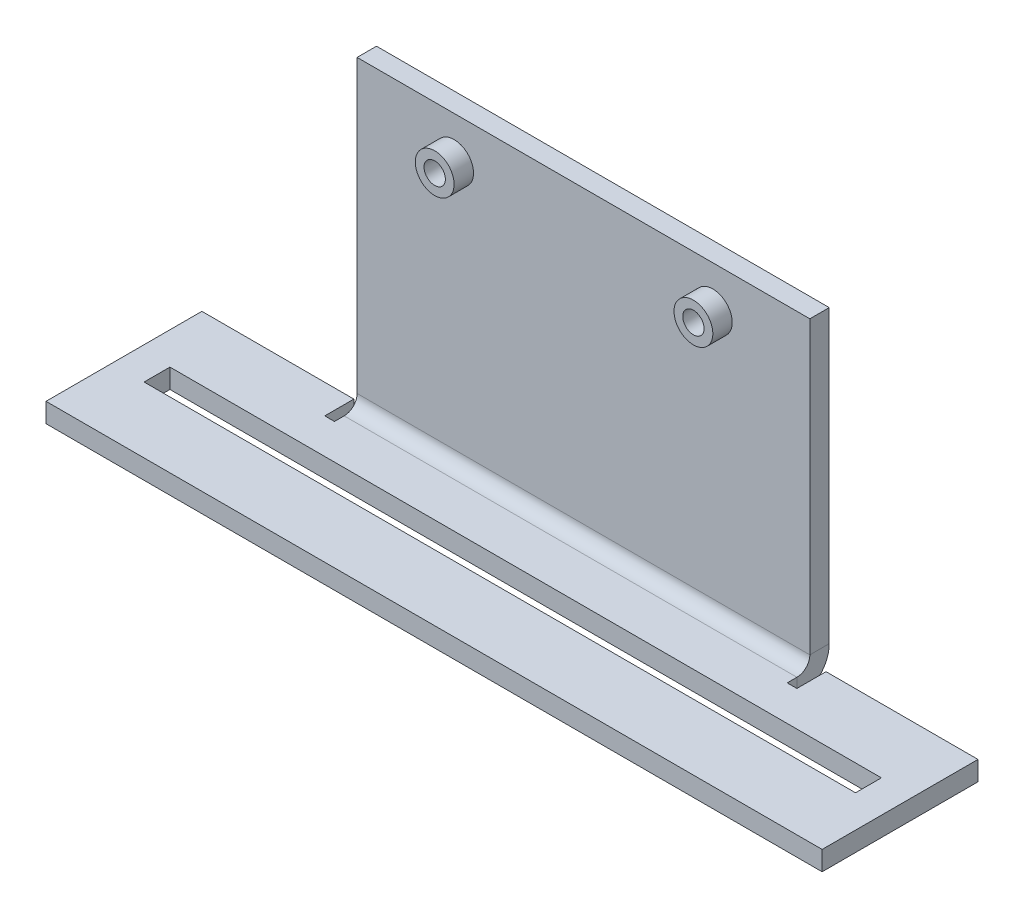
ISO-10303-21;
HEADER;
FILE_DESCRIPTION(('STEP AP214'),'2;1');
FILE_NAME('part.step','',(''),(''),'','','');
FILE_SCHEMA(('AUTOMOTIVE_DESIGN { 1 0 10303 214 1 1 1 1 }'));
ENDSEC;
DATA;
#1=APPLICATION_CONTEXT('core data for automotive mechanical design processes');
#2=APPLICATION_PROTOCOL_DEFINITION('international standard','automotive_design',2000,#1);
#3=PRODUCT_CONTEXT('',#1,'mechanical');
#4=PRODUCT('Part','Part','',(#3));
#5=PRODUCT_RELATED_PRODUCT_CATEGORY('part','',(#4));
#6=PRODUCT_DEFINITION_FORMATION('','',#4);
#7=PRODUCT_DEFINITION_CONTEXT('part definition',#1,'design');
#8=PRODUCT_DEFINITION('design','',#6,#7);
#9=PRODUCT_DEFINITION_SHAPE('','',#8);
#10=(LENGTH_UNIT() NAMED_UNIT(*) SI_UNIT(.MILLI.,.METRE.));
#11=(NAMED_UNIT(*) PLANE_ANGLE_UNIT() SI_UNIT($,.RADIAN.));
#12=(NAMED_UNIT(*) SI_UNIT($,.STERADIAN.) SOLID_ANGLE_UNIT());
#13=UNCERTAINTY_MEASURE_WITH_UNIT(LENGTH_MEASURE(1.E-05),#10,'distance_accuracy_value','');
#14=(GEOMETRIC_REPRESENTATION_CONTEXT(3) GLOBAL_UNCERTAINTY_ASSIGNED_CONTEXT((#13)) GLOBAL_UNIT_ASSIGNED_CONTEXT((#10,
#11,#12)) REPRESENTATION_CONTEXT('',''));
#15=CARTESIAN_POINT('',(0.,0.,0.));
#16=DIRECTION('',(0.,0.,1.));
#17=DIRECTION('',(1.,0.,0.));
#18=AXIS2_PLACEMENT_3D('',#15,#16,#17);
#19=CARTESIAN_POINT('',(25.,-3.,17.652065));
#20=DIRECTION('',(0.,0.,-1.));
#21=DIRECTION('',(-1.,0.,0.));
#22=AXIS2_PLACEMENT_3D('',#19,#20,#21);
#23=PLANE('',#22);
#24=DIRECTION('',(-1.,0.,0.));
#25=VECTOR('',#24,1.);
#26=CARTESIAN_POINT('',(25.,0.,17.652065));
#27=LINE('',#26,#25);
#28=CARTESIAN_POINT('',(23.5,0.,17.652065));
#29=VERTEX_POINT('',#28);
#30=CARTESIAN_POINT('',(0.,0.,17.652065));
#31=VERTEX_POINT('',#30);
#32=EDGE_CURVE('E392',#29,#31,#27,.T.);
#33=ORIENTED_EDGE('',*,*,#32,.F.);
#34=DIRECTION('',(0.,-1.,0.));
#35=VECTOR('',#34,1.);
#36=CARTESIAN_POINT('',(23.5,-3.,17.652065));
#37=LINE('',#36,#35);
#38=CARTESIAN_POINT('',(23.5,-3.,17.652065));
#39=VERTEX_POINT('',#38);
#40=EDGE_CURVE('E382',#29,#39,#37,.T.);
#41=ORIENTED_EDGE('',*,*,#40,.T.);
#42=DIRECTION('',(-1.,0.,0.));
#43=VECTOR('',#42,1.);
#44=CARTESIAN_POINT('',(25.,-3.,17.652065));
#45=LINE('',#44,#43);
#46=CARTESIAN_POINT('',(0.,-3.,17.652065));
#47=VERTEX_POINT('',#46);
#48=EDGE_CURVE('E404',#39,#47,#45,.T.);
#49=ORIENTED_EDGE('',*,*,#48,.T.);
#50=DIRECTION('',(0.,1.,0.));
#51=VECTOR('',#50,1.);
#52=CARTESIAN_POINT('',(0.,-3.,17.652065));
#53=LINE('',#52,#51);
#54=EDGE_CURVE('E76',#47,#31,#53,.T.);
#55=ORIENTED_EDGE('',*,*,#54,.T.);
#56=EDGE_LOOP('',(#33,#41,#49,#55));
#57=FACE_BOUND('',#56,.T.);
#58=ADVANCED_FACE('F67',(#57),#23,.T.);
#59=CARTESIAN_POINT('',(120.,-3.,17.652065));
#60=DIRECTION('',(0.,0.,-1.));
#61=DIRECTION('',(-1.,0.,0.));
#62=AXIS2_PLACEMENT_3D('',#59,#60,#61);
#63=PLANE('',#62);
#64=DIRECTION('',(-1.,0.,0.));
#65=VECTOR('',#64,1.);
#66=CARTESIAN_POINT('',(120.,-3.,17.652065));
#67=LINE('',#66,#65);
#68=CARTESIAN_POINT('',(120.,-3.,17.652065));
#69=VERTEX_POINT('',#68);
#70=CARTESIAN_POINT('',(96.5,-3.,17.652065));
#71=VERTEX_POINT('',#70);
#72=EDGE_CURVE('E400',#69,#71,#67,.T.);
#73=ORIENTED_EDGE('',*,*,#72,.T.);
#74=DIRECTION('',(0.,1.,0.));
#75=VECTOR('',#74,1.);
#76=CARTESIAN_POINT('',(96.5,-3.,17.652065));
#77=LINE('',#76,#75);
#78=CARTESIAN_POINT('',(96.5,0.,17.652065));
#79=VERTEX_POINT('',#78);
#80=EDGE_CURVE('E363',#71,#79,#77,.T.);
#81=ORIENTED_EDGE('',*,*,#80,.T.);
#82=DIRECTION('',(-1.,0.,0.));
#83=VECTOR('',#82,1.);
#84=CARTESIAN_POINT('',(120.,0.,17.652065));
#85=LINE('',#84,#83);
#86=CARTESIAN_POINT('',(120.,0.,17.652065));
#87=VERTEX_POINT('',#86);
#88=EDGE_CURVE('E419',#87,#79,#85,.T.);
#89=ORIENTED_EDGE('',*,*,#88,.F.);
#90=DIRECTION('',(0.,1.,0.));
#91=VECTOR('',#90,1.);
#92=CARTESIAN_POINT('',(120.,-3.,17.652065));
#93=LINE('',#92,#91);
#94=EDGE_CURVE('E428',#69,#87,#93,.T.);
#95=ORIENTED_EDGE('',*,*,#94,.F.);
#96=EDGE_LOOP('',(#73,#81,#89,#95));
#97=FACE_BOUND('',#96,.T.);
#98=ADVANCED_FACE('F459',(#97),#63,.T.);
#99=CARTESIAN_POINT('',(0.,-3.,0.));
#100=DIRECTION('',(0.,1.,0.));
#101=DIRECTION('',(0.,0.,1.));
#102=AXIS2_PLACEMENT_3D('',#99,#100,#101);
#103=PLANE('',#102);
#104=DIRECTION('',(-1.,0.,0.));
#105=VECTOR('',#104,1.);
#106=CARTESIAN_POINT('',(0.,-3.,27.5882648403536));
#107=LINE('',#106,#105);
#108=CARTESIAN_POINT('',(115.,-3.,27.5882648403536));
#109=VERTEX_POINT('',#108);
#110=CARTESIAN_POINT('',(5.,-3.,27.5882648403536));
#111=VERTEX_POINT('',#110);
#112=EDGE_CURVE('E245',#109,#111,#107,.T.);
#113=ORIENTED_EDGE('',*,*,#112,.T.);
#114=DIRECTION('',(0.,0.,1.));
#115=VECTOR('',#114,1.);
#116=CARTESIAN_POINT('',(4.99999999999999,-3.,0.));
#117=LINE('',#116,#115);
#118=CARTESIAN_POINT('',(5.,-3.,31.5882648403536));
#119=VERTEX_POINT('',#118);
#120=EDGE_CURVE('E249',#111,#119,#117,.T.);
#121=ORIENTED_EDGE('',*,*,#120,.T.);
#122=DIRECTION('',(1.,0.,0.));
#123=VECTOR('',#122,1.);
#124=CARTESIAN_POINT('',(0.,-3.,31.5882648403536));
#125=LINE('',#124,#123);
#126=CARTESIAN_POINT('',(115.,-3.,31.5882648403536));
#127=VERTEX_POINT('',#126);
#128=EDGE_CURVE('E236',#119,#127,#125,.T.);
#129=ORIENTED_EDGE('',*,*,#128,.T.);
#130=DIRECTION('',(0.,0.,-1.));
#131=VECTOR('',#130,1.);
#132=CARTESIAN_POINT('',(115.,-3.,0.));
#133=LINE('',#132,#131);
#134=EDGE_CURVE('E211',#127,#109,#133,.T.);
#135=ORIENTED_EDGE('',*,*,#134,.T.);
#136=EDGE_LOOP('',(#113,#121,#129,#135));
#137=FACE_BOUND('',#136,.T.);
#138=DIRECTION('',(0.,0.,-1.));
#139=VECTOR('',#138,1.);
#140=CARTESIAN_POINT('',(23.5,-3.,0.));
#141=LINE('',#140,#139);
#142=CARTESIAN_POINT('',(23.5,-3.,22.152065));
#143=VERTEX_POINT('',#142);
#144=EDGE_CURVE('E379',#143,#39,#141,.T.);
#145=ORIENTED_EDGE('',*,*,#144,.F.);
#146=DIRECTION('',(-1.,0.,0.));
#147=VECTOR('',#146,1.);
#148=CARTESIAN_POINT('',(0.,-3.,22.152065));
#149=LINE('',#148,#147);
#150=CARTESIAN_POINT('',(25.,-3.,22.152065));
#151=VERTEX_POINT('',#150);
#152=EDGE_CURVE('E376',#151,#143,#149,.T.);
#153=ORIENTED_EDGE('',*,*,#152,.F.);
#154=DIRECTION('',(0.,0.,1.));
#155=VECTOR('',#154,1.);
#156=CARTESIAN_POINT('',(25.,-3.,0.));
#157=LINE('',#156,#155);
#158=CARTESIAN_POINT('',(25.,-3.00000000000003,20.652065));
#159=VERTEX_POINT('',#158);
#160=EDGE_CURVE('E373',#159,#151,#157,.T.);
#161=ORIENTED_EDGE('',*,*,#160,.F.);
#162=DIRECTION('',(-1.,0.,0.));
#163=VECTOR('',#162,1.);
#164=CARTESIAN_POINT('',(25.,-3.00000000000003,20.652065));
#165=LINE('',#164,#163);
#166=CARTESIAN_POINT('',(95.,-3.,20.652065));
#167=VERTEX_POINT('',#166);
#168=EDGE_CURVE('E296',#159,#167,#165,.F.);
#169=ORIENTED_EDGE('',*,*,#168,.T.);
#170=DIRECTION('',(0.,0.,-1.));
#171=VECTOR('',#170,1.);
#172=CARTESIAN_POINT('',(95.,-3.,0.));
#173=LINE('',#172,#171);
#174=CARTESIAN_POINT('',(95.,-3.,22.152065));
#175=VERTEX_POINT('',#174);
#176=EDGE_CURVE('E370',#175,#167,#173,.T.);
#177=ORIENTED_EDGE('',*,*,#176,.F.);
#178=DIRECTION('',(-1.,0.,0.));
#179=VECTOR('',#178,1.);
#180=CARTESIAN_POINT('',(0.,-3.,22.152065));
#181=LINE('',#180,#179);
#182=CARTESIAN_POINT('',(96.5,-3.,22.152065));
#183=VERTEX_POINT('',#182);
#184=EDGE_CURVE('E367',#183,#175,#181,.T.);
#185=ORIENTED_EDGE('',*,*,#184,.F.);
#186=DIRECTION('',(0.,0.,1.));
#187=VECTOR('',#186,1.);
#188=CARTESIAN_POINT('',(96.5,-3.,0.));
#189=LINE('',#188,#187);
#190=EDGE_CURVE('E332',#71,#183,#189,.T.);
#191=ORIENTED_EDGE('',*,*,#190,.F.);
#192=ORIENTED_EDGE('',*,*,#72,.F.);
#193=DIRECTION('',(0.,0.,-1.));
#194=VECTOR('',#193,1.);
#195=CARTESIAN_POINT('',(120.,-3.,41.752065));
#196=LINE('',#195,#194);
#197=CARTESIAN_POINT('',(120.,-3.,41.752065));
#198=VERTEX_POINT('',#197);
#199=EDGE_CURVE('E396',#198,#69,#196,.T.);
#200=ORIENTED_EDGE('',*,*,#199,.F.);
#201=DIRECTION('',(1.,0.,0.));
#202=VECTOR('',#201,1.);
#203=CARTESIAN_POINT('',(0.,-3.,41.752065));
#204=LINE('',#203,#202);
#205=CARTESIAN_POINT('',(0.,-3.,41.752065));
#206=VERTEX_POINT('',#205);
#207=EDGE_CURVE('E391',#206,#198,#204,.T.);
#208=ORIENTED_EDGE('',*,*,#207,.F.);
#209=DIRECTION('',(0.,0.,1.));
#210=VECTOR('',#209,1.);
#211=CARTESIAN_POINT('',(0.,-3.,17.652065));
#212=LINE('',#211,#210);
#213=EDGE_CURVE('E387',#47,#206,#212,.T.);
#214=ORIENTED_EDGE('',*,*,#213,.F.);
#215=ORIENTED_EDGE('',*,*,#48,.F.);
#216=EDGE_LOOP('',(#145,#153,#161,#169,#177,#185,#191,#192,#200,#208,#214,#215));
#217=FACE_BOUND('',#216,.T.);
#218=ADVANCED_FACE('F449',(#137,#217),#103,.F.);
#219=CARTESIAN_POINT('',(0.,0.,0.));
#220=DIRECTION('',(0.,1.,0.));
#221=DIRECTION('',(0.,0.,1.));
#222=AXIS2_PLACEMENT_3D('',#219,#220,#221);
#223=PLANE('',#222);
#224=DIRECTION('',(0.,0.,1.));
#225=VECTOR('',#224,1.);
#226=CARTESIAN_POINT('',(5.,0.,27.5882648403536));
#227=LINE('',#226,#225);
#228=CARTESIAN_POINT('',(5.,0.,27.5882648403536));
#229=VERTEX_POINT('',#228);
#230=CARTESIAN_POINT('',(5.,0.,31.5882648403536));
#231=VERTEX_POINT('',#230);
#232=EDGE_CURVE('E91',#229,#231,#227,.T.);
#233=ORIENTED_EDGE('',*,*,#232,.F.);
#234=DIRECTION('',(-1.,0.,0.));
#235=VECTOR('',#234,1.);
#236=CARTESIAN_POINT('',(5.,0.,27.5882648403536));
#237=LINE('',#236,#235);
#238=CARTESIAN_POINT('',(115.,0.,27.5882648403536));
#239=VERTEX_POINT('',#238);
#240=EDGE_CURVE('E226',#239,#229,#237,.T.);
#241=ORIENTED_EDGE('',*,*,#240,.F.);
#242=DIRECTION('',(0.,0.,-1.));
#243=VECTOR('',#242,1.);
#244=CARTESIAN_POINT('',(115.,0.,27.5882648403536));
#245=LINE('',#244,#243);
#246=CARTESIAN_POINT('',(115.,0.,31.5882648403536));
#247=VERTEX_POINT('',#246);
#248=EDGE_CURVE('E208',#247,#239,#245,.T.);
#249=ORIENTED_EDGE('',*,*,#248,.F.);
#250=DIRECTION('',(1.,0.,0.));
#251=VECTOR('',#250,1.);
#252=CARTESIAN_POINT('',(5.,0.,31.5882648403536));
#253=LINE('',#252,#251);
#254=EDGE_CURVE('E218',#231,#247,#253,.T.);
#255=ORIENTED_EDGE('',*,*,#254,.F.);
#256=EDGE_LOOP('',(#233,#241,#249,#255));
#257=FACE_BOUND('',#256,.T.);
#258=DIRECTION('',(1.,0.,0.));
#259=VECTOR('',#258,1.);
#260=CARTESIAN_POINT('',(23.5,0.,22.152065));
#261=LINE('',#260,#259);
#262=CARTESIAN_POINT('',(23.5,0.,22.152065));
#263=VERTEX_POINT('',#262);
#264=CARTESIAN_POINT('',(25.,0.,22.152065));
#265=VERTEX_POINT('',#264);
#266=EDGE_CURVE('E328',#263,#265,#261,.T.);
#267=ORIENTED_EDGE('',*,*,#266,.F.);
#268=DIRECTION('',(0.,0.,-1.));
#269=VECTOR('',#268,1.);
#270=CARTESIAN_POINT('',(23.5,0.,0.));
#271=LINE('',#270,#269);
#272=EDGE_CURVE('E13',#263,#29,#271,.T.);
#273=ORIENTED_EDGE('',*,*,#272,.T.);
#274=ORIENTED_EDGE('',*,*,#32,.T.);
#275=DIRECTION('',(0.,0.,1.));
#276=VECTOR('',#275,1.);
#277=CARTESIAN_POINT('',(0.,0.,17.652065));
#278=LINE('',#277,#276);
#279=CARTESIAN_POINT('',(0.,0.,41.752065));
#280=VERTEX_POINT('',#279);
#281=EDGE_CURVE('E386',#31,#280,#278,.T.);
#282=ORIENTED_EDGE('',*,*,#281,.T.);
#283=DIRECTION('',(1.,0.,0.));
#284=VECTOR('',#283,1.);
#285=CARTESIAN_POINT('',(0.,0.,41.752065));
#286=LINE('',#285,#284);
#287=CARTESIAN_POINT('',(120.,0.,41.752065));
#288=VERTEX_POINT('',#287);
#289=EDGE_CURVE('E411',#280,#288,#286,.T.);
#290=ORIENTED_EDGE('',*,*,#289,.T.);
#291=DIRECTION('',(0.,0.,-1.));
#292=VECTOR('',#291,1.);
#293=CARTESIAN_POINT('',(120.,0.,41.752065));
#294=LINE('',#293,#292);
#295=EDGE_CURVE('E415',#288,#87,#294,.T.);
#296=ORIENTED_EDGE('',*,*,#295,.T.);
#297=ORIENTED_EDGE('',*,*,#88,.T.);
#298=DIRECTION('',(0.,0.,-1.));
#299=VECTOR('',#298,1.);
#300=CARTESIAN_POINT('',(96.5,0.,22.152065));
#301=LINE('',#300,#299);
#302=CARTESIAN_POINT('',(96.5,0.,22.152065));
#303=VERTEX_POINT('',#302);
#304=EDGE_CURVE('E346',#303,#79,#301,.T.);
#305=ORIENTED_EDGE('',*,*,#304,.F.);
#306=DIRECTION('',(1.,0.,0.));
#307=VECTOR('',#306,1.);
#308=CARTESIAN_POINT('',(95.,0.,22.152065));
#309=LINE('',#308,#307);
#310=CARTESIAN_POINT('',(95.,0.,22.152065));
#311=VERTEX_POINT('',#310);
#312=EDGE_CURVE('E342',#311,#303,#309,.T.);
#313=ORIENTED_EDGE('',*,*,#312,.F.);
#314=DIRECTION('',(0.,0.,1.));
#315=VECTOR('',#314,1.);
#316=CARTESIAN_POINT('',(95.,0.,20.652065));
#317=LINE('',#316,#315);
#318=CARTESIAN_POINT('',(95.,0.,20.652065));
#319=VERTEX_POINT('',#318);
#320=EDGE_CURVE('E338',#319,#311,#317,.T.);
#321=ORIENTED_EDGE('',*,*,#320,.F.);
#322=DIRECTION('',(-1.,0.,0.));
#323=VECTOR('',#322,1.);
#324=CARTESIAN_POINT('',(25.,0.,20.652065));
#325=LINE('',#324,#323);
#326=CARTESIAN_POINT('',(25.,0.,20.652065));
#327=VERTEX_POINT('',#326);
#328=EDGE_CURVE('E313',#327,#319,#325,.F.);
#329=ORIENTED_EDGE('',*,*,#328,.F.);
#330=DIRECTION('',(0.,0.,-1.));
#331=VECTOR('',#330,1.);
#332=CARTESIAN_POINT('',(25.,0.,22.152065));
#333=LINE('',#332,#331);
#334=EDGE_CURVE('E334',#265,#327,#333,.T.);
#335=ORIENTED_EDGE('',*,*,#334,.F.);
#336=EDGE_LOOP('',(#267,#273,#274,#282,#290,#296,#297,#305,#313,#321,#329,#335));
#337=FACE_BOUND('',#336,.T.);
#338=ADVANCED_FACE('F223',(#257,#337),#223,.T.);
#339=CARTESIAN_POINT('',(0.,-3.,17.652065));
#340=DIRECTION('',(-1.,0.,0.));
#341=DIRECTION('',(0.,0.,1.));
#342=AXIS2_PLACEMENT_3D('',#339,#340,#341);
#343=PLANE('',#342);
#344=ORIENTED_EDGE('',*,*,#281,.F.);
#345=ORIENTED_EDGE('',*,*,#54,.F.);
#346=ORIENTED_EDGE('',*,*,#213,.T.);
#347=DIRECTION('',(0.,1.,0.));
#348=VECTOR('',#347,1.);
#349=CARTESIAN_POINT('',(0.,-3.,41.752065));
#350=LINE('',#349,#348);
#351=EDGE_CURVE('E407',#206,#280,#350,.T.);
#352=ORIENTED_EDGE('',*,*,#351,.T.);
#353=EDGE_LOOP('',(#344,#345,#346,#352));
#354=FACE_BOUND('',#353,.T.);
#355=ADVANCED_FACE('F69',(#354),#343,.T.);
#356=CARTESIAN_POINT('',(120.,-3.,41.752065));
#357=DIRECTION('',(1.,0.,0.));
#358=DIRECTION('',(0.,0.,-1.));
#359=AXIS2_PLACEMENT_3D('',#356,#357,#358);
#360=PLANE('',#359);
#361=ORIENTED_EDGE('',*,*,#295,.F.);
#362=DIRECTION('',(0.,1.,0.));
#363=VECTOR('',#362,1.);
#364=CARTESIAN_POINT('',(120.,-3.,41.752065));
#365=LINE('',#364,#363);
#366=EDGE_CURVE('E431',#198,#288,#365,.T.);
#367=ORIENTED_EDGE('',*,*,#366,.F.);
#368=ORIENTED_EDGE('',*,*,#199,.T.);
#369=ORIENTED_EDGE('',*,*,#94,.T.);
#370=EDGE_LOOP('',(#361,#367,#368,#369));
#371=FACE_BOUND('',#370,.T.);
#372=ADVANCED_FACE('F454',(#371),#360,.T.);
#373=CARTESIAN_POINT('',(0.,-3.,41.752065));
#374=DIRECTION('',(0.,0.,1.));
#375=DIRECTION('',(1.,0.,0.));
#376=AXIS2_PLACEMENT_3D('',#373,#374,#375);
#377=PLANE('',#376);
#378=ORIENTED_EDGE('',*,*,#289,.F.);
#379=ORIENTED_EDGE('',*,*,#351,.F.);
#380=ORIENTED_EDGE('',*,*,#207,.T.);
#381=ORIENTED_EDGE('',*,*,#366,.T.);
#382=EDGE_LOOP('',(#378,#379,#380,#381));
#383=FACE_BOUND('',#382,.T.);
#384=ADVANCED_FACE('F441',(#383),#377,.T.);
#385=CARTESIAN_POINT('',(23.5,0.,22.152065));
#386=DIRECTION('',(0.,0.,-1.));
#387=DIRECTION('',(0.,1.,0.));
#388=AXIS2_PLACEMENT_3D('',#385,#386,#387);
#389=PLANE('',#388);
#390=DIRECTION('',(0.,-1.,0.));
#391=VECTOR('',#390,1.);
#392=CARTESIAN_POINT('',(25.,0.,22.152065));
#393=LINE('',#392,#391);
#394=EDGE_CURVE('E337',#265,#151,#393,.T.);
#395=ORIENTED_EDGE('',*,*,#394,.T.);
#396=ORIENTED_EDGE('',*,*,#152,.T.);
#397=DIRECTION('',(0.,-1.,0.));
#398=VECTOR('',#397,1.);
#399=CARTESIAN_POINT('',(23.5,0.,22.152065));
#400=LINE('',#399,#398);
#401=EDGE_CURVE('E333',#263,#143,#400,.T.);
#402=ORIENTED_EDGE('',*,*,#401,.F.);
#403=ORIENTED_EDGE('',*,*,#266,.T.);
#404=EDGE_LOOP('',(#395,#396,#402,#403));
#405=FACE_BOUND('',#404,.T.);
#406=ADVANCED_FACE('F525',(#405),#389,.T.);
#407=CARTESIAN_POINT('',(25.,0.,22.152065));
#408=DIRECTION('',(-1.,0.,0.));
#409=DIRECTION('',(0.,0.,1.));
#410=AXIS2_PLACEMENT_3D('',#407,#408,#409);
#411=PLANE('',#410);
#412=DIRECTION('',(0.,-1.,0.));
#413=VECTOR('',#412,1.);
#414=CARTESIAN_POINT('',(25.,0.,20.652065));
#415=LINE('',#414,#413);
#416=EDGE_CURVE('E305',#327,#159,#415,.T.);
#417=ORIENTED_EDGE('',*,*,#416,.T.);
#418=ORIENTED_EDGE('',*,*,#160,.T.);
#419=ORIENTED_EDGE('',*,*,#394,.F.);
#420=ORIENTED_EDGE('',*,*,#334,.T.);
#421=EDGE_LOOP('',(#417,#418,#419,#420));
#422=FACE_BOUND('',#421,.T.);
#423=ADVANCED_FACE('F529',(#422),#411,.T.);
#424=CARTESIAN_POINT('',(95.,0.,20.652065));
#425=DIRECTION('',(1.,0.,0.));
#426=DIRECTION('',(0.,0.,-1.));
#427=AXIS2_PLACEMENT_3D('',#424,#425,#426);
#428=PLANE('',#427);
#429=DIRECTION('',(0.,-1.,0.));
#430=VECTOR('',#429,1.);
#431=CARTESIAN_POINT('',(95.,0.,22.152065));
#432=LINE('',#431,#430);
#433=EDGE_CURVE('E345',#311,#175,#432,.T.);
#434=ORIENTED_EDGE('',*,*,#433,.T.);
#435=ORIENTED_EDGE('',*,*,#176,.T.);
#436=DIRECTION('',(0.,-1.,0.));
#437=VECTOR('',#436,1.);
#438=CARTESIAN_POINT('',(95.,0.,20.652065));
#439=LINE('',#438,#437);
#440=EDGE_CURVE('E320',#319,#167,#439,.T.);
#441=ORIENTED_EDGE('',*,*,#440,.F.);
#442=ORIENTED_EDGE('',*,*,#320,.T.);
#443=EDGE_LOOP('',(#434,#435,#441,#442));
#444=FACE_BOUND('',#443,.T.);
#445=ADVANCED_FACE('F468',(#444),#428,.T.);
#446=CARTESIAN_POINT('',(95.,0.,22.152065));
#447=DIRECTION('',(0.,0.,-1.));
#448=DIRECTION('',(0.,1.,0.));
#449=AXIS2_PLACEMENT_3D('',#446,#447,#448);
#450=PLANE('',#449);
#451=DIRECTION('',(0.,-1.,0.));
#452=VECTOR('',#451,1.);
#453=CARTESIAN_POINT('',(96.5,0.,22.152065));
#454=LINE('',#453,#452);
#455=EDGE_CURVE('E324',#303,#183,#454,.T.);
#456=ORIENTED_EDGE('',*,*,#455,.T.);
#457=ORIENTED_EDGE('',*,*,#184,.T.);
#458=ORIENTED_EDGE('',*,*,#433,.F.);
#459=ORIENTED_EDGE('',*,*,#312,.T.);
#460=EDGE_LOOP('',(#456,#457,#458,#459));
#461=FACE_BOUND('',#460,.T.);
#462=ADVANCED_FACE('F466',(#461),#450,.T.);
#463=CARTESIAN_POINT('',(23.5,0.,15.652065));
#464=DIRECTION('',(1.,0.,0.));
#465=DIRECTION('',(0.,0.,-1.));
#466=AXIS2_PLACEMENT_3D('',#463,#464,#465);
#467=PLANE('',#466);
#468=ORIENTED_EDGE('',*,*,#40,.F.);
#469=ORIENTED_EDGE('',*,*,#272,.F.);
#470=ORIENTED_EDGE('',*,*,#401,.T.);
#471=ORIENTED_EDGE('',*,*,#144,.T.);
#472=EDGE_LOOP('',(#468,#469,#470,#471));
#473=FACE_BOUND('',#472,.T.);
#474=ADVANCED_FACE('F539',(#473),#467,.T.);
#475=CARTESIAN_POINT('',(96.5,0.,22.152065));
#476=DIRECTION('',(-1.,0.,0.));
#477=DIRECTION('',(0.,0.,1.));
#478=AXIS2_PLACEMENT_3D('',#475,#476,#477);
#479=PLANE('',#478);
#480=ORIENTED_EDGE('',*,*,#80,.F.);
#481=ORIENTED_EDGE('',*,*,#190,.T.);
#482=ORIENTED_EDGE('',*,*,#455,.F.);
#483=ORIENTED_EDGE('',*,*,#304,.T.);
#484=EDGE_LOOP('',(#480,#481,#482,#483));
#485=FACE_BOUND('',#484,.T.);
#486=ADVANCED_FACE('F461',(#485),#479,.T.);
#487=CARTESIAN_POINT('',(95.,1.99999999999998,20.652065));
#488=DIRECTION('',(1.,0.,0.));
#489=DIRECTION('',(0.,0.,-1.));
#490=AXIS2_PLACEMENT_3D('',#487,#488,#489);
#491=PLANE('',#490);
#492=DIRECTION('',(0.,0.,1.));
#493=VECTOR('',#492,1.);
#494=CARTESIAN_POINT('',(95.,2.00000000000001,15.652065));
#495=LINE('',#494,#493);
#496=CARTESIAN_POINT('',(95.,1.99999999999997,18.652065));
#497=VERTEX_POINT('',#496);
#498=CARTESIAN_POINT('',(95.,1.99999999999996,15.652065));
#499=VERTEX_POINT('',#498);
#500=EDGE_CURVE('E253',#497,#499,#495,.F.);
#501=ORIENTED_EDGE('',*,*,#500,.F.);
#502=CARTESIAN_POINT('',(95.,1.99999999999998,20.652065));
#503=DIRECTION('',(-1.,0.,0.));
#504=DIRECTION('',(0.,0.,1.));
#505=AXIS2_PLACEMENT_3D('',#502,#503,#504);
#506=CIRCLE('',#505,2.00000000000001);
#507=EDGE_CURVE('E309',#319,#497,#506,.F.);
#508=ORIENTED_EDGE('',*,*,#507,.F.);
#509=ORIENTED_EDGE('',*,*,#440,.T.);
#510=CARTESIAN_POINT('',(95.,1.99999999999998,20.652065));
#511=DIRECTION('',(-1.,0.,0.));
#512=DIRECTION('',(0.,0.,1.));
#513=AXIS2_PLACEMENT_3D('',#510,#511,#512);
#514=CIRCLE('',#513,5.00000000000001);
#515=EDGE_CURVE('E300',#167,#499,#514,.F.);
#516=ORIENTED_EDGE('',*,*,#515,.T.);
#517=EDGE_LOOP('',(#501,#508,#509,#516));
#518=FACE_BOUND('',#517,.T.);
#519=ADVANCED_FACE('F479',(#518),#491,.T.);
#520=CARTESIAN_POINT('',(25.,1.99999999999998,20.652065));
#521=DIRECTION('',(1.,0.,0.));
#522=DIRECTION('',(0.,0.,-1.));
#523=AXIS2_PLACEMENT_3D('',#520,#521,#522);
#524=PLANE('',#523);
#525=CARTESIAN_POINT('',(25.,1.99999999999998,20.652065));
#526=DIRECTION('',(-1.,0.,0.));
#527=DIRECTION('',(0.,0.,1.));
#528=AXIS2_PLACEMENT_3D('',#525,#526,#527);
#529=CIRCLE('',#528,2.00000000000001);
#530=CARTESIAN_POINT('',(25.,1.99999999999997,18.652065));
#531=VERTEX_POINT('',#530);
#532=EDGE_CURVE('E258',#531,#327,#529,.T.);
#533=ORIENTED_EDGE('',*,*,#532,.F.);
#534=DIRECTION('',(0.,0.,1.));
#535=VECTOR('',#534,1.);
#536=CARTESIAN_POINT('',(25.,1.99999999999999,18.652065));
#537=LINE('',#536,#535);
#538=CARTESIAN_POINT('',(25.,2.00000000000001,15.652065));
#539=VERTEX_POINT('',#538);
#540=EDGE_CURVE('E286',#531,#539,#537,.F.);
#541=ORIENTED_EDGE('',*,*,#540,.T.);
#542=CARTESIAN_POINT('',(25.,1.99999999999998,20.652065));
#543=DIRECTION('',(-1.,0.,0.));
#544=DIRECTION('',(0.,0.,1.));
#545=AXIS2_PLACEMENT_3D('',#542,#543,#544);
#546=CIRCLE('',#545,5.00000000000001);
#547=EDGE_CURVE('E301',#539,#159,#546,.T.);
#548=ORIENTED_EDGE('',*,*,#547,.T.);
#549=ORIENTED_EDGE('',*,*,#416,.F.);
#550=EDGE_LOOP('',(#533,#541,#548,#549));
#551=FACE_BOUND('',#550,.T.);
#552=ADVANCED_FACE('F500',(#551),#524,.F.);
#553=CARTESIAN_POINT('',(25.,1.99999999999998,20.652065));
#554=DIRECTION('',(-1.,0.,0.));
#555=DIRECTION('',(0.,0.,-1.));
#556=AXIS2_PLACEMENT_3D('',#553,#554,#555);
#557=CYLINDRICAL_SURFACE('',#556,5.00000000000001);
#558=ORIENTED_EDGE('',*,*,#168,.F.);
#559=ORIENTED_EDGE('',*,*,#547,.F.);
#560=DIRECTION('',(-1.,0.,0.));
#561=VECTOR('',#560,1.);
#562=CARTESIAN_POINT('',(95.,2.00000000000001,15.652065));
#563=LINE('',#562,#561);
#564=EDGE_CURVE('E283',#539,#499,#563,.F.);
#565=ORIENTED_EDGE('',*,*,#564,.T.);
#566=ORIENTED_EDGE('',*,*,#515,.F.);
#567=EDGE_LOOP('',(#558,#559,#565,#566));
#568=FACE_BOUND('',#567,.T.);
#569=ADVANCED_FACE('F726',(#568),#557,.T.);
#570=CARTESIAN_POINT('',(25.,1.99999999999998,20.652065));
#571=DIRECTION('',(-1.,0.,0.));
#572=DIRECTION('',(0.,0.,-1.));
#573=AXIS2_PLACEMENT_3D('',#570,#571,#572);
#574=CYLINDRICAL_SURFACE('',#573,2.00000000000001);
#575=ORIENTED_EDGE('',*,*,#328,.T.);
#576=ORIENTED_EDGE('',*,*,#507,.T.);
#577=DIRECTION('',(-1.,0.,0.));
#578=VECTOR('',#577,1.);
#579=CARTESIAN_POINT('',(95.,1.99999999999999,18.652065));
#580=LINE('',#579,#578);
#581=EDGE_CURVE('E290',#497,#531,#580,.T.);
#582=ORIENTED_EDGE('',*,*,#581,.T.);
#583=ORIENTED_EDGE('',*,*,#532,.T.);
#584=EDGE_LOOP('',(#575,#576,#582,#583));
#585=FACE_BOUND('',#584,.T.);
#586=ADVANCED_FACE('F475',(#585),#574,.F.);
#587=CARTESIAN_POINT('',(95.,0.,15.652065));
#588=DIRECTION('',(-1.,0.,0.));
#589=DIRECTION('',(0.,0.,1.));
#590=AXIS2_PLACEMENT_3D('',#587,#588,#589);
#591=PLANE('',#590);
#592=ORIENTED_EDGE('',*,*,#500,.T.);
#593=DIRECTION('',(0.,-1.,0.));
#594=VECTOR('',#593,1.);
#595=CARTESIAN_POINT('',(95.,0.,15.652065));
#596=LINE('',#595,#594);
#597=CARTESIAN_POINT('',(95.,47.,15.6520649999998));
#598=VERTEX_POINT('',#597);
#599=EDGE_CURVE('E269',#598,#499,#596,.T.);
#600=ORIENTED_EDGE('',*,*,#599,.F.);
#601=DIRECTION('',(0.,0.,1.));
#602=VECTOR('',#601,1.);
#603=CARTESIAN_POINT('',(95.,47.,15.6520649999998));
#604=LINE('',#603,#602);
#605=CARTESIAN_POINT('',(95.,47.,18.6520649999998));
#606=VERTEX_POINT('',#605);
#607=EDGE_CURVE('E259',#598,#606,#604,.T.);
#608=ORIENTED_EDGE('',*,*,#607,.T.);
#609=DIRECTION('',(0.,1.,0.));
#610=VECTOR('',#609,1.);
#611=CARTESIAN_POINT('',(95.,0.,18.652065));
#612=LINE('',#611,#610);
#613=EDGE_CURVE('E279',#606,#497,#612,.F.);
#614=ORIENTED_EDGE('',*,*,#613,.T.);
#615=EDGE_LOOP('',(#592,#600,#608,#614));
#616=FACE_BOUND('',#615,.T.);
#617=ADVANCED_FACE('F483',(#616),#591,.F.);
#618=CARTESIAN_POINT('',(25.,47.,15.6520649999998));
#619=DIRECTION('',(1.,0.,0.));
#620=DIRECTION('',(0.,0.,-1.));
#621=AXIS2_PLACEMENT_3D('',#618,#619,#620);
#622=PLANE('',#621);
#623=ORIENTED_EDGE('',*,*,#540,.F.);
#624=DIRECTION('',(0.,-1.,0.));
#625=VECTOR('',#624,1.);
#626=CARTESIAN_POINT('',(25.,47.,18.6520649999998));
#627=LINE('',#626,#625);
#628=CARTESIAN_POINT('',(25.,47.,18.6520649999998));
#629=VERTEX_POINT('',#628);
#630=EDGE_CURVE('E276',#531,#629,#627,.F.);
#631=ORIENTED_EDGE('',*,*,#630,.T.);
#632=DIRECTION('',(0.,0.,1.));
#633=VECTOR('',#632,1.);
#634=CARTESIAN_POINT('',(25.,47.,15.6520649999998));
#635=LINE('',#634,#633);
#636=CARTESIAN_POINT('',(25.,47.,15.6520649999998));
#637=VERTEX_POINT('',#636);
#638=EDGE_CURVE('E254',#637,#629,#635,.T.);
#639=ORIENTED_EDGE('',*,*,#638,.F.);
#640=DIRECTION('',(0.,1.,0.));
#641=VECTOR('',#640,1.);
#642=CARTESIAN_POINT('',(25.,0.,15.652065));
#643=LINE('',#642,#641);
#644=EDGE_CURVE('E266',#539,#637,#643,.T.);
#645=ORIENTED_EDGE('',*,*,#644,.F.);
#646=EDGE_LOOP('',(#623,#631,#639,#645));
#647=FACE_BOUND('',#646,.T.);
#648=ADVANCED_FACE('F502',(#647),#622,.F.);
#649=CARTESIAN_POINT('',(0.,0.,15.652065));
#650=DIRECTION('',(0.,0.,1.));
#651=DIRECTION('',(0.,-1.,0.));
#652=AXIS2_PLACEMENT_3D('',#649,#650,#651);
#653=PLANE('',#652);
#654=CARTESIAN_POINT('',(40.,40.5,15.652065));
#655=DIRECTION('',(0.,0.,1.));
#656=DIRECTION('',(1.,0.,0.));
#657=AXIS2_PLACEMENT_3D('',#654,#655,#656);
#658=CIRCLE('',#657,1.65);
#659=CARTESIAN_POINT('',(41.65,40.5,15.652065));
#660=VERTEX_POINT('',#659);
#661=EDGE_CURVE('E582',#660,#660,#658,.T.);
#662=ORIENTED_EDGE('',*,*,#661,.T.);
#663=EDGE_LOOP('',(#662));
#664=FACE_BOUND('',#663,.T.);
#665=CARTESIAN_POINT('',(80.,40.5,15.652065));
#666=DIRECTION('',(0.,0.,1.));
#667=DIRECTION('',(1.,0.,0.));
#668=AXIS2_PLACEMENT_3D('',#665,#666,#667);
#669=CIRCLE('',#668,1.65000000000002);
#670=CARTESIAN_POINT('',(81.65,40.5,15.652065));
#671=VERTEX_POINT('',#670);
#672=EDGE_CURVE('E591',#671,#671,#669,.T.);
#673=ORIENTED_EDGE('',*,*,#672,.T.);
#674=EDGE_LOOP('',(#673));
#675=FACE_BOUND('',#674,.T.);
#676=ORIENTED_EDGE('',*,*,#564,.F.);
#677=ORIENTED_EDGE('',*,*,#644,.T.);
#678=DIRECTION('',(1.,0.,0.));
#679=VECTOR('',#678,1.);
#680=CARTESIAN_POINT('',(0.,47.,15.6520649999998));
#681=LINE('',#680,#679);
#682=EDGE_CURVE('E263',#637,#598,#681,.T.);
#683=ORIENTED_EDGE('',*,*,#682,.T.);
#684=ORIENTED_EDGE('',*,*,#599,.T.);
#685=EDGE_LOOP('',(#676,#677,#683,#684));
#686=FACE_BOUND('',#685,.T.);
#687=ADVANCED_FACE('F487',(#664,#675,#686),#653,.F.);
#688=CARTESIAN_POINT('',(0.,0.,18.652065));
#689=DIRECTION('',(0.,0.,1.));
#690=DIRECTION('',(0.,-1.,0.));
#691=AXIS2_PLACEMENT_3D('',#688,#689,#690);
#692=PLANE('',#691);
#693=CARTESIAN_POINT('',(40.,40.5,18.652065));
#694=DIRECTION('',(0.,0.,1.));
#695=DIRECTION('',(1.,0.,0.));
#696=AXIS2_PLACEMENT_3D('',#693,#694,#695);
#697=CIRCLE('',#696,3.);
#698=CARTESIAN_POINT('',(43.,40.5,18.652065));
#699=VERTEX_POINT('',#698);
#700=EDGE_CURVE('E569',#699,#699,#697,.T.);
#701=ORIENTED_EDGE('',*,*,#700,.F.);
#702=EDGE_LOOP('',(#701));
#703=FACE_BOUND('',#702,.T.);
#704=CARTESIAN_POINT('',(80.,40.5,18.652065));
#705=DIRECTION('',(0.,0.,1.));
#706=DIRECTION('',(-1.,0.,0.));
#707=AXIS2_PLACEMENT_3D('',#704,#705,#706);
#708=CIRCLE('',#707,3.00000000000001);
#709=CARTESIAN_POINT('',(77.,40.5,18.652065));
#710=VERTEX_POINT('',#709);
#711=EDGE_CURVE('E572',#710,#710,#708,.T.);
#712=ORIENTED_EDGE('',*,*,#711,.F.);
#713=EDGE_LOOP('',(#712));
#714=FACE_BOUND('',#713,.T.);
#715=ORIENTED_EDGE('',*,*,#630,.F.);
#716=ORIENTED_EDGE('',*,*,#581,.F.);
#717=ORIENTED_EDGE('',*,*,#613,.F.);
#718=DIRECTION('',(-1.,0.,0.));
#719=VECTOR('',#718,1.);
#720=CARTESIAN_POINT('',(95.,47.,18.6520649999998));
#721=LINE('',#720,#719);
#722=EDGE_CURVE('E273',#629,#606,#721,.F.);
#723=ORIENTED_EDGE('',*,*,#722,.F.);
#724=EDGE_LOOP('',(#715,#716,#717,#723));
#725=FACE_BOUND('',#724,.T.);
#726=ADVANCED_FACE('F497',(#703,#714,#725),#692,.T.);
#727=CARTESIAN_POINT('',(95.,47.,15.6520649999998));
#728=DIRECTION('',(0.,-1.,0.));
#729=DIRECTION('',(0.,0.,-1.));
#730=AXIS2_PLACEMENT_3D('',#727,#728,#729);
#731=PLANE('',#730);
#732=ORIENTED_EDGE('',*,*,#722,.T.);
#733=ORIENTED_EDGE('',*,*,#607,.F.);
#734=ORIENTED_EDGE('',*,*,#682,.F.);
#735=ORIENTED_EDGE('',*,*,#638,.T.);
#736=EDGE_LOOP('',(#732,#733,#734,#735));
#737=FACE_BOUND('',#736,.T.);
#738=ADVANCED_FACE('F493',(#737),#731,.F.);
#739=CARTESIAN_POINT('',(5.,-30.,27.5882648403536));
#740=DIRECTION('',(-1.,0.,0.));
#741=DIRECTION('',(0.,0.,1.));
#742=AXIS2_PLACEMENT_3D('',#739,#740,#741);
#743=PLANE('',#742);
#744=DIRECTION('',(0.,1.,0.));
#745=VECTOR('',#744,1.);
#746=CARTESIAN_POINT('',(5.,-30.,27.5882648403536));
#747=LINE('',#746,#745);
#748=EDGE_CURVE('E233',#111,#229,#747,.T.);
#749=ORIENTED_EDGE('',*,*,#748,.T.);
#750=ORIENTED_EDGE('',*,*,#232,.T.);
#751=DIRECTION('',(0.,1.,0.));
#752=VECTOR('',#751,1.);
#753=CARTESIAN_POINT('',(5.,-30.,31.5882648403536));
#754=LINE('',#753,#752);
#755=EDGE_CURVE('E215',#119,#231,#754,.T.);
#756=ORIENTED_EDGE('',*,*,#755,.F.);
#757=ORIENTED_EDGE('',*,*,#120,.F.);
#758=EDGE_LOOP('',(#749,#750,#756,#757));
#759=FACE_BOUND('',#758,.T.);
#760=ADVANCED_FACE('F550',(#759),#743,.F.);
#761=CARTESIAN_POINT('',(5.,-30.,27.5882648403536));
#762=DIRECTION('',(0.,0.,-1.));
#763=DIRECTION('',(-1.,0.,0.));
#764=AXIS2_PLACEMENT_3D('',#761,#762,#763);
#765=PLANE('',#764);
#766=DIRECTION('',(0.,1.,0.));
#767=VECTOR('',#766,1.);
#768=CARTESIAN_POINT('',(115.,-30.,27.5882648403536));
#769=LINE('',#768,#767);
#770=EDGE_CURVE('E214',#109,#239,#769,.T.);
#771=ORIENTED_EDGE('',*,*,#770,.T.);
#772=ORIENTED_EDGE('',*,*,#240,.T.);
#773=ORIENTED_EDGE('',*,*,#748,.F.);
#774=ORIENTED_EDGE('',*,*,#112,.F.);
#775=EDGE_LOOP('',(#771,#772,#773,#774));
#776=FACE_BOUND('',#775,.T.);
#777=ADVANCED_FACE('F549',(#776),#765,.F.);
#778=CARTESIAN_POINT('',(115.,-30.,27.5882648403536));
#779=DIRECTION('',(1.,0.,0.));
#780=DIRECTION('',(0.,0.,-1.));
#781=AXIS2_PLACEMENT_3D('',#778,#779,#780);
#782=PLANE('',#781);
#783=DIRECTION('',(0.,1.,0.));
#784=VECTOR('',#783,1.);
#785=CARTESIAN_POINT('',(115.,-30.,31.5882648403536));
#786=LINE('',#785,#784);
#787=EDGE_CURVE('E83',#127,#247,#786,.T.);
#788=ORIENTED_EDGE('',*,*,#787,.T.);
#789=ORIENTED_EDGE('',*,*,#248,.T.);
#790=ORIENTED_EDGE('',*,*,#770,.F.);
#791=ORIENTED_EDGE('',*,*,#134,.F.);
#792=EDGE_LOOP('',(#788,#789,#790,#791));
#793=FACE_BOUND('',#792,.T.);
#794=ADVANCED_FACE('F205',(#793),#782,.F.);
#795=CARTESIAN_POINT('',(5.,-30.,31.5882648403536));
#796=DIRECTION('',(0.,0.,1.));
#797=DIRECTION('',(1.,0.,0.));
#798=AXIS2_PLACEMENT_3D('',#795,#796,#797);
#799=PLANE('',#798);
#800=ORIENTED_EDGE('',*,*,#755,.T.);
#801=ORIENTED_EDGE('',*,*,#254,.T.);
#802=ORIENTED_EDGE('',*,*,#787,.F.);
#803=ORIENTED_EDGE('',*,*,#128,.F.);
#804=EDGE_LOOP('',(#800,#801,#802,#803));
#805=FACE_BOUND('',#804,.T.);
#806=ADVANCED_FACE('F219',(#805),#799,.F.);
#807=CARTESIAN_POINT('',(80.,40.5,21.652065));
#808=DIRECTION('',(0.,0.,-1.));
#809=DIRECTION('',(-1.,0.,0.));
#810=AXIS2_PLACEMENT_3D('',#807,#808,#809);
#811=CYLINDRICAL_SURFACE('',#810,3.00000000000001);
#812=CARTESIAN_POINT('',(80.,40.5,21.652065));
#813=DIRECTION('',(0.,0.,1.));
#814=DIRECTION('',(-1.,0.,0.));
#815=AXIS2_PLACEMENT_3D('',#812,#813,#814);
#816=CIRCLE('',#815,3.00000000000001);
#817=CARTESIAN_POINT('',(77.,40.5,21.652065));
#818=VERTEX_POINT('',#817);
#819=EDGE_CURVE('E575',#818,#818,#816,.T.);
#820=ORIENTED_EDGE('',*,*,#819,.F.);
#821=EDGE_LOOP('',(#820));
#822=FACE_BOUND('',#821,.T.);
#823=ORIENTED_EDGE('',*,*,#711,.T.);
#824=EDGE_LOOP('',(#823));
#825=FACE_BOUND('',#824,.T.);
#826=ADVANCED_FACE('F628',(#822,#825),#811,.T.);
#827=CARTESIAN_POINT('',(80.,40.5,21.652065));
#828=DIRECTION('',(0.,0.,-1.));
#829=DIRECTION('',(-1.,0.,0.));
#830=AXIS2_PLACEMENT_3D('',#827,#828,#829);
#831=PLANE('',#830);
#832=CARTESIAN_POINT('',(80.,40.5,21.652065));
#833=DIRECTION('',(0.,0.,1.));
#834=DIRECTION('',(1.,0.,0.));
#835=AXIS2_PLACEMENT_3D('',#832,#833,#834);
#836=CIRCLE('',#835,1.65000000000002);
#837=CARTESIAN_POINT('',(81.65,40.5,21.652065));
#838=VERTEX_POINT('',#837);
#839=EDGE_CURVE('E595',#838,#838,#836,.T.);
#840=ORIENTED_EDGE('',*,*,#839,.F.);
#841=EDGE_LOOP('',(#840));
#842=FACE_BOUND('',#841,.T.);
#843=ORIENTED_EDGE('',*,*,#819,.T.);
#844=EDGE_LOOP('',(#843));
#845=FACE_BOUND('',#844,.T.);
#846=ADVANCED_FACE('F623',(#842,#845),#831,.F.);
#847=CARTESIAN_POINT('',(40.,40.5,21.652065));
#848=DIRECTION('',(0.,0.,-1.));
#849=DIRECTION('',(-1.,0.,0.));
#850=AXIS2_PLACEMENT_3D('',#847,#848,#849);
#851=CYLINDRICAL_SURFACE('',#850,3.);
#852=CARTESIAN_POINT('',(40.,40.5,21.652065));
#853=DIRECTION('',(0.,0.,1.));
#854=DIRECTION('',(1.,0.,0.));
#855=AXIS2_PLACEMENT_3D('',#852,#853,#854);
#856=CIRCLE('',#855,3.);
#857=CARTESIAN_POINT('',(43.,40.5,21.652065));
#858=VERTEX_POINT('',#857);
#859=EDGE_CURVE('E579',#858,#858,#856,.T.);
#860=ORIENTED_EDGE('',*,*,#859,.F.);
#861=EDGE_LOOP('',(#860));
#862=FACE_BOUND('',#861,.T.);
#863=ORIENTED_EDGE('',*,*,#700,.T.);
#864=EDGE_LOOP('',(#863));
#865=FACE_BOUND('',#864,.T.);
#866=ADVANCED_FACE('F617',(#862,#865),#851,.T.);
#867=CARTESIAN_POINT('',(40.,40.5,21.652065));
#868=DIRECTION('',(0.,0.,1.));
#869=DIRECTION('',(1.,0.,0.));
#870=AXIS2_PLACEMENT_3D('',#867,#868,#869);
#871=PLANE('',#870);
#872=CARTESIAN_POINT('',(40.,40.5,21.652065));
#873=DIRECTION('',(0.,0.,1.));
#874=DIRECTION('',(1.,0.,0.));
#875=AXIS2_PLACEMENT_3D('',#872,#873,#874);
#876=CIRCLE('',#875,1.65);
#877=CARTESIAN_POINT('',(41.65,40.5,21.652065));
#878=VERTEX_POINT('',#877);
#879=EDGE_CURVE('E599',#878,#878,#876,.T.);
#880=ORIENTED_EDGE('',*,*,#879,.F.);
#881=EDGE_LOOP('',(#880));
#882=FACE_BOUND('',#881,.T.);
#883=ORIENTED_EDGE('',*,*,#859,.T.);
#884=EDGE_LOOP('',(#883));
#885=FACE_BOUND('',#884,.T.);
#886=ADVANCED_FACE('F612',(#882,#885),#871,.T.);
#887=CARTESIAN_POINT('',(40.,40.5,15.652065));
#888=DIRECTION('',(0.,0.,1.));
#889=DIRECTION('',(1.,0.,0.));
#890=AXIS2_PLACEMENT_3D('',#887,#888,#889);
#891=CYLINDRICAL_SURFACE('',#890,1.65);
#892=ORIENTED_EDGE('',*,*,#661,.F.);
#893=EDGE_LOOP('',(#892));
#894=FACE_BOUND('',#893,.T.);
#895=ORIENTED_EDGE('',*,*,#879,.T.);
#896=EDGE_LOOP('',(#895));
#897=FACE_BOUND('',#896,.T.);
#898=ADVANCED_FACE('F608',(#894,#897),#891,.F.);
#899=CARTESIAN_POINT('',(80.,40.5,15.652065));
#900=DIRECTION('',(0.,0.,1.));
#901=DIRECTION('',(1.,0.,0.));
#902=AXIS2_PLACEMENT_3D('',#899,#900,#901);
#903=CYLINDRICAL_SURFACE('',#902,1.65000000000002);
#904=ORIENTED_EDGE('',*,*,#672,.F.);
#905=EDGE_LOOP('',(#904));
#906=FACE_BOUND('',#905,.T.);
#907=ORIENTED_EDGE('',*,*,#839,.T.);
#908=EDGE_LOOP('',(#907));
#909=FACE_BOUND('',#908,.T.);
#910=ADVANCED_FACE('F611',(#906,#909),#903,.F.);
#911=CLOSED_SHELL('',(#58,#98,#218,#338,#355,#372,#384,#406,#423,#445,#462,#474,#486,#519,#552,
#569,#586,#617,#648,#687,#726,#738,#760,#777,#794,#806,#826,#846,#866,#886,#898,#910));
#912=MANIFOLD_SOLID_BREP('B2',#911);
#913=ADVANCED_BREP_SHAPE_REPRESENTATION('',(#18,#912),#14);
#914=SHAPE_DEFINITION_REPRESENTATION(#9,#913);
ENDSEC;
END-ISO-10303-21;
